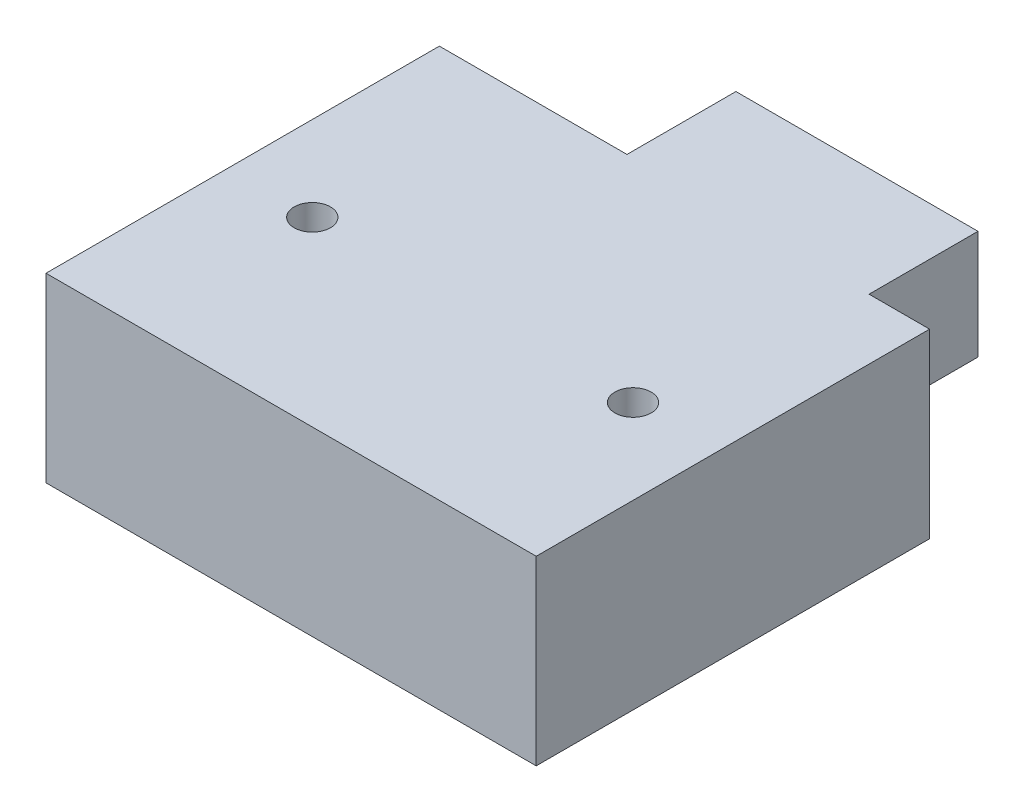
ISO-10303-21;
HEADER;
FILE_DESCRIPTION(('STEP AP214'),'2;1');
FILE_NAME('part.step','',(''),(''),'','','');
FILE_SCHEMA(('AUTOMOTIVE_DESIGN { 1 0 10303 214 1 1 1 1 }'));
ENDSEC;
DATA;
#1=APPLICATION_CONTEXT('core data for automotive mechanical design processes');
#2=APPLICATION_PROTOCOL_DEFINITION('international standard','automotive_design',2000,#1);
#3=PRODUCT_CONTEXT('',#1,'mechanical');
#4=PRODUCT('Part','Part','',(#3));
#5=PRODUCT_RELATED_PRODUCT_CATEGORY('part','',(#4));
#6=PRODUCT_DEFINITION_FORMATION('','',#4);
#7=PRODUCT_DEFINITION_CONTEXT('part definition',#1,'design');
#8=PRODUCT_DEFINITION('design','',#6,#7);
#9=PRODUCT_DEFINITION_SHAPE('','',#8);
#10=(LENGTH_UNIT() NAMED_UNIT(*) SI_UNIT(.MILLI.,.METRE.));
#11=(NAMED_UNIT(*) PLANE_ANGLE_UNIT() SI_UNIT($,.RADIAN.));
#12=(NAMED_UNIT(*) SI_UNIT($,.STERADIAN.) SOLID_ANGLE_UNIT());
#13=UNCERTAINTY_MEASURE_WITH_UNIT(LENGTH_MEASURE(1.E-05),#10,'distance_accuracy_value','');
#14=(GEOMETRIC_REPRESENTATION_CONTEXT(3) GLOBAL_UNCERTAINTY_ASSIGNED_CONTEXT((#13)) GLOBAL_UNIT_ASSIGNED_CONTEXT((#10,
#11,#12)) REPRESENTATION_CONTEXT('',''));
#15=CARTESIAN_POINT('',(0.,0.,0.));
#16=DIRECTION('',(0.,0.,1.));
#17=DIRECTION('',(1.,0.,0.));
#18=AXIS2_PLACEMENT_3D('',#15,#16,#17);
#19=CARTESIAN_POINT('',(-20.25,15.,-16.25));
#20=DIRECTION('',(0.,0.,1.));
#21=DIRECTION('',(1.,0.,0.));
#22=AXIS2_PLACEMENT_3D('',#19,#20,#21);
#23=PLANE('',#22);
#24=DIRECTION('',(0.,-1.,0.));
#25=VECTOR('',#24,1.);
#26=CARTESIAN_POINT('',(15.25,15.,-16.25));
#27=LINE('',#26,#25);
#28=CARTESIAN_POINT('',(15.25,15.,-16.25));
#29=VERTEX_POINT('',#28);
#30=CARTESIAN_POINT('',(15.25,6.,-16.25));
#31=VERTEX_POINT('',#30);
#32=EDGE_CURVE('E132',#29,#31,#27,.T.);
#33=ORIENTED_EDGE('',*,*,#32,.F.);
#34=DIRECTION('',(-1.,0.,0.));
#35=VECTOR('',#34,1.);
#36=CARTESIAN_POINT('',(-20.25,15.,-16.25));
#37=LINE('',#36,#35);
#38=CARTESIAN_POINT('',(20.25,15.,-16.25));
#39=VERTEX_POINT('',#38);
#40=EDGE_CURVE('E162',#39,#29,#37,.T.);
#41=ORIENTED_EDGE('',*,*,#40,.F.);
#42=DIRECTION('',(0.,-1.,0.));
#43=VECTOR('',#42,1.);
#44=CARTESIAN_POINT('',(20.25,15.,-16.25));
#45=LINE('',#44,#43);
#46=CARTESIAN_POINT('',(20.25,0.,-16.25));
#47=VERTEX_POINT('',#46);
#48=EDGE_CURVE('E11',#39,#47,#45,.T.);
#49=ORIENTED_EDGE('',*,*,#48,.T.);
#50=DIRECTION('',(-1.,0.,0.));
#51=VECTOR('',#50,1.);
#52=CARTESIAN_POINT('',(-20.25,0.,-16.25));
#53=LINE('',#52,#51);
#54=CARTESIAN_POINT('',(-20.25,0.,-16.25));
#55=VERTEX_POINT('',#54);
#56=EDGE_CURVE('E176',#47,#55,#53,.T.);
#57=ORIENTED_EDGE('',*,*,#56,.T.);
#58=DIRECTION('',(0.,-1.,0.));
#59=VECTOR('',#58,1.);
#60=CARTESIAN_POINT('',(-20.25,15.,-16.25));
#61=LINE('',#60,#59);
#62=CARTESIAN_POINT('',(-20.25,15.,-16.25));
#63=VERTEX_POINT('',#62);
#64=EDGE_CURVE('E52',#63,#55,#61,.T.);
#65=ORIENTED_EDGE('',*,*,#64,.F.);
#66=CARTESIAN_POINT('',(-4.75,15.,-16.25));
#67=VERTEX_POINT('',#66);
#68=EDGE_CURVE('E65',#67,#63,#37,.T.);
#69=ORIENTED_EDGE('',*,*,#68,.F.);
#70=DIRECTION('',(0.,1.,0.));
#71=VECTOR('',#70,1.);
#72=CARTESIAN_POINT('',(-4.75,15.,-16.25));
#73=LINE('',#72,#71);
#74=CARTESIAN_POINT('',(-4.75,6.,-16.25));
#75=VERTEX_POINT('',#74);
#76=EDGE_CURVE('E129',#75,#67,#73,.T.);
#77=ORIENTED_EDGE('',*,*,#76,.F.);
#78=DIRECTION('',(-1.,0.,0.));
#79=VECTOR('',#78,1.);
#80=CARTESIAN_POINT('',(15.25,6.,-16.25));
#81=LINE('',#80,#79);
#82=EDGE_CURVE('E59',#31,#75,#81,.T.);
#83=ORIENTED_EDGE('',*,*,#82,.F.);
#84=EDGE_LOOP('',(#33,#41,#49,#57,#65,#69,#77,#83));
#85=FACE_BOUND('',#84,.T.);
#86=ADVANCED_FACE('F43',(#85),#23,.F.);
#87=CARTESIAN_POINT('',(0.,15.,0.));
#88=DIRECTION('',(0.,-1.,0.));
#89=DIRECTION('',(0.,0.,-1.));
#90=AXIS2_PLACEMENT_3D('',#87,#88,#89);
#91=PLANE('',#90);
#92=DIRECTION('',(0.,0.,-1.));
#93=VECTOR('',#92,1.);
#94=CARTESIAN_POINT('',(20.25,15.,16.25));
#95=LINE('',#94,#93);
#96=CARTESIAN_POINT('',(20.25,15.,16.25));
#97=VERTEX_POINT('',#96);
#98=EDGE_CURVE('E157',#97,#39,#95,.T.);
#99=ORIENTED_EDGE('',*,*,#98,.T.);
#100=ORIENTED_EDGE('',*,*,#40,.T.);
#101=DIRECTION('',(0.,0.,1.));
#102=VECTOR('',#101,1.);
#103=CARTESIAN_POINT('',(15.25,15.,-25.25));
#104=LINE('',#103,#102);
#105=CARTESIAN_POINT('',(15.25,15.,-25.25));
#106=VERTEX_POINT('',#105);
#107=EDGE_CURVE('E217',#106,#29,#104,.T.);
#108=ORIENTED_EDGE('',*,*,#107,.F.);
#109=DIRECTION('',(1.,0.,0.));
#110=VECTOR('',#109,1.);
#111=CARTESIAN_POINT('',(15.25,15.,-25.25));
#112=LINE('',#111,#110);
#113=CARTESIAN_POINT('',(-4.75,15.,-25.25));
#114=VERTEX_POINT('',#113);
#115=EDGE_CURVE('E124',#114,#106,#112,.T.);
#116=ORIENTED_EDGE('',*,*,#115,.F.);
#117=DIRECTION('',(0.,0.,1.));
#118=VECTOR('',#117,1.);
#119=CARTESIAN_POINT('',(-4.75,15.,-25.25));
#120=LINE('',#119,#118);
#121=EDGE_CURVE('E141',#114,#67,#120,.T.);
#122=ORIENTED_EDGE('',*,*,#121,.T.);
#123=ORIENTED_EDGE('',*,*,#68,.T.);
#124=DIRECTION('',(0.,0.,1.));
#125=VECTOR('',#124,1.);
#126=CARTESIAN_POINT('',(-20.25,15.,16.25));
#127=LINE('',#126,#125);
#128=CARTESIAN_POINT('',(-20.25,15.,16.25));
#129=VERTEX_POINT('',#128);
#130=EDGE_CURVE('E166',#63,#129,#127,.T.);
#131=ORIENTED_EDGE('',*,*,#130,.T.);
#132=DIRECTION('',(1.,0.,0.));
#133=VECTOR('',#132,1.);
#134=CARTESIAN_POINT('',(-20.25,15.,16.25));
#135=LINE('',#134,#133);
#136=EDGE_CURVE('E169',#129,#97,#135,.T.);
#137=ORIENTED_EDGE('',*,*,#136,.T.);
#138=EDGE_LOOP('',(#99,#100,#108,#116,#122,#123,#131,#137));
#139=FACE_BOUND('',#138,.T.);
#140=CARTESIAN_POINT('',(-13.25,15.,1.25));
#141=DIRECTION('',(0.,1.,0.));
#142=DIRECTION('',(0.,0.,1.));
#143=AXIS2_PLACEMENT_3D('',#140,#141,#142);
#144=CIRCLE('',#143,1.5);
#145=CARTESIAN_POINT('',(-13.25,15.,2.75));
#146=VERTEX_POINT('',#145);
#147=EDGE_CURVE('E149',#146,#146,#144,.T.);
#148=ORIENTED_EDGE('',*,*,#147,.F.);
#149=EDGE_LOOP('',(#148));
#150=FACE_BOUND('',#149,.T.);
#151=CARTESIAN_POINT('',(13.25,15.,1.25));
#152=DIRECTION('',(0.,1.,0.));
#153=DIRECTION('',(0.,0.,1.));
#154=AXIS2_PLACEMENT_3D('',#151,#152,#153);
#155=CIRCLE('',#154,1.5);
#156=CARTESIAN_POINT('',(13.25,15.,2.75));
#157=VERTEX_POINT('',#156);
#158=EDGE_CURVE('E139',#157,#157,#155,.T.);
#159=ORIENTED_EDGE('',*,*,#158,.F.);
#160=EDGE_LOOP('',(#159));
#161=FACE_BOUND('',#160,.T.);
#162=ADVANCED_FACE('F210',(#139,#150,#161),#91,.F.);
#163=CARTESIAN_POINT('',(0.,0.,0.));
#164=DIRECTION('',(0.,-1.,0.));
#165=DIRECTION('',(0.,0.,-1.));
#166=AXIS2_PLACEMENT_3D('',#163,#164,#165);
#167=PLANE('',#166);
#168=CARTESIAN_POINT('',(-13.25,0.,1.25));
#169=DIRECTION('',(0.,1.,0.));
#170=DIRECTION('',(0.,0.,1.));
#171=AXIS2_PLACEMENT_3D('',#168,#169,#170);
#172=CIRCLE('',#171,1.5);
#173=CARTESIAN_POINT('',(-13.25,0.,2.75));
#174=VERTEX_POINT('',#173);
#175=EDGE_CURVE('E147',#174,#174,#172,.T.);
#176=ORIENTED_EDGE('',*,*,#175,.T.);
#177=EDGE_LOOP('',(#176));
#178=FACE_BOUND('',#177,.T.);
#179=DIRECTION('',(0.,0.,-1.));
#180=VECTOR('',#179,1.);
#181=CARTESIAN_POINT('',(20.25,0.,16.25));
#182=LINE('',#181,#180);
#183=CARTESIAN_POINT('',(20.25,0.,16.25));
#184=VERTEX_POINT('',#183);
#185=EDGE_CURVE('E153',#184,#47,#182,.T.);
#186=ORIENTED_EDGE('',*,*,#185,.F.);
#187=DIRECTION('',(1.,0.,0.));
#188=VECTOR('',#187,1.);
#189=CARTESIAN_POINT('',(-20.25,0.,16.25));
#190=LINE('',#189,#188);
#191=CARTESIAN_POINT('',(-20.25,0.,16.25));
#192=VERTEX_POINT('',#191);
#193=EDGE_CURVE('E161',#192,#184,#190,.T.);
#194=ORIENTED_EDGE('',*,*,#193,.F.);
#195=DIRECTION('',(0.,0.,1.));
#196=VECTOR('',#195,1.);
#197=CARTESIAN_POINT('',(-20.25,0.,16.25));
#198=LINE('',#197,#196);
#199=EDGE_CURVE('E179',#55,#192,#198,.T.);
#200=ORIENTED_EDGE('',*,*,#199,.F.);
#201=ORIENTED_EDGE('',*,*,#56,.F.);
#202=EDGE_LOOP('',(#186,#194,#200,#201));
#203=FACE_BOUND('',#202,.T.);
#204=CARTESIAN_POINT('',(13.25,0.,1.25));
#205=DIRECTION('',(0.,1.,0.));
#206=DIRECTION('',(0.,0.,1.));
#207=AXIS2_PLACEMENT_3D('',#204,#205,#206);
#208=CIRCLE('',#207,1.5);
#209=CARTESIAN_POINT('',(13.25,0.,2.75));
#210=VERTEX_POINT('',#209);
#211=EDGE_CURVE('E134',#210,#210,#208,.T.);
#212=ORIENTED_EDGE('',*,*,#211,.T.);
#213=EDGE_LOOP('',(#212));
#214=FACE_BOUND('',#213,.T.);
#215=ADVANCED_FACE('F200',(#178,#203,#214),#167,.T.);
#216=CARTESIAN_POINT('',(20.25,15.,16.25));
#217=DIRECTION('',(-1.,0.,0.));
#218=DIRECTION('',(0.,0.,1.));
#219=AXIS2_PLACEMENT_3D('',#216,#217,#218);
#220=PLANE('',#219);
#221=ORIENTED_EDGE('',*,*,#185,.T.);
#222=ORIENTED_EDGE('',*,*,#48,.F.);
#223=ORIENTED_EDGE('',*,*,#98,.F.);
#224=DIRECTION('',(0.,-1.,0.));
#225=VECTOR('',#224,1.);
#226=CARTESIAN_POINT('',(20.25,15.,16.25));
#227=LINE('',#226,#225);
#228=EDGE_CURVE('E172',#97,#184,#227,.T.);
#229=ORIENTED_EDGE('',*,*,#228,.T.);
#230=EDGE_LOOP('',(#221,#222,#223,#229));
#231=FACE_BOUND('',#230,.T.);
#232=ADVANCED_FACE('F45',(#231),#220,.F.);
#233=CARTESIAN_POINT('',(-20.25,15.,16.25));
#234=DIRECTION('',(1.,0.,0.));
#235=DIRECTION('',(0.,0.,-1.));
#236=AXIS2_PLACEMENT_3D('',#233,#234,#235);
#237=PLANE('',#236);
#238=ORIENTED_EDGE('',*,*,#199,.T.);
#239=DIRECTION('',(0.,-1.,0.));
#240=VECTOR('',#239,1.);
#241=CARTESIAN_POINT('',(-20.25,15.,16.25));
#242=LINE('',#241,#240);
#243=EDGE_CURVE('E187',#129,#192,#242,.T.);
#244=ORIENTED_EDGE('',*,*,#243,.F.);
#245=ORIENTED_EDGE('',*,*,#130,.F.);
#246=ORIENTED_EDGE('',*,*,#64,.T.);
#247=EDGE_LOOP('',(#238,#244,#245,#246));
#248=FACE_BOUND('',#247,.T.);
#249=ADVANCED_FACE('F195',(#248),#237,.F.);
#250=CARTESIAN_POINT('',(-20.25,15.,16.25));
#251=DIRECTION('',(0.,0.,-1.));
#252=DIRECTION('',(-1.,0.,0.));
#253=AXIS2_PLACEMENT_3D('',#250,#251,#252);
#254=PLANE('',#253);
#255=ORIENTED_EDGE('',*,*,#193,.T.);
#256=ORIENTED_EDGE('',*,*,#228,.F.);
#257=ORIENTED_EDGE('',*,*,#136,.F.);
#258=ORIENTED_EDGE('',*,*,#243,.T.);
#259=EDGE_LOOP('',(#255,#256,#257,#258));
#260=FACE_BOUND('',#259,.T.);
#261=ADVANCED_FACE('F204',(#260),#254,.F.);
#262=CARTESIAN_POINT('',(-13.25,15.,1.25));
#263=DIRECTION('',(0.,-1.,0.));
#264=DIRECTION('',(0.,0.,-1.));
#265=AXIS2_PLACEMENT_3D('',#262,#263,#264);
#266=CYLINDRICAL_SURFACE('',#265,1.5);
#267=ORIENTED_EDGE('',*,*,#147,.T.);
#268=EDGE_LOOP('',(#267));
#269=FACE_BOUND('',#268,.T.);
#270=ORIENTED_EDGE('',*,*,#175,.F.);
#271=EDGE_LOOP('',(#270));
#272=FACE_BOUND('',#271,.T.);
#273=ADVANCED_FACE('F241',(#269,#272),#266,.F.);
#274=CARTESIAN_POINT('',(13.25,15.,1.25));
#275=DIRECTION('',(0.,-1.,0.));
#276=DIRECTION('',(0.,0.,-1.));
#277=AXIS2_PLACEMENT_3D('',#274,#275,#276);
#278=CYLINDRICAL_SURFACE('',#277,1.5);
#279=ORIENTED_EDGE('',*,*,#158,.T.);
#280=EDGE_LOOP('',(#279));
#281=FACE_BOUND('',#280,.T.);
#282=ORIENTED_EDGE('',*,*,#211,.F.);
#283=EDGE_LOOP('',(#282));
#284=FACE_BOUND('',#283,.T.);
#285=ADVANCED_FACE('F247',(#281,#284),#278,.F.);
#286=CARTESIAN_POINT('',(15.25,15.,-25.25));
#287=DIRECTION('',(-1.,0.,0.));
#288=DIRECTION('',(0.,-1.,0.));
#289=AXIS2_PLACEMENT_3D('',#286,#287,#288);
#290=PLANE('',#289);
#291=ORIENTED_EDGE('',*,*,#32,.T.);
#292=DIRECTION('',(0.,0.,1.));
#293=VECTOR('',#292,1.);
#294=CARTESIAN_POINT('',(15.25,6.,-25.25));
#295=LINE('',#294,#293);
#296=CARTESIAN_POINT('',(15.25,6.,-25.25));
#297=VERTEX_POINT('',#296);
#298=EDGE_CURVE('E111',#297,#31,#295,.T.);
#299=ORIENTED_EDGE('',*,*,#298,.F.);
#300=DIRECTION('',(0.,-1.,0.));
#301=VECTOR('',#300,1.);
#302=CARTESIAN_POINT('',(15.25,15.,-25.25));
#303=LINE('',#302,#301);
#304=EDGE_CURVE('E119',#106,#297,#303,.T.);
#305=ORIENTED_EDGE('',*,*,#304,.F.);
#306=ORIENTED_EDGE('',*,*,#107,.T.);
#307=EDGE_LOOP('',(#291,#299,#305,#306));
#308=FACE_BOUND('',#307,.T.);
#309=ADVANCED_FACE('F131',(#308),#290,.F.);
#310=CARTESIAN_POINT('',(15.25,6.,-25.25));
#311=DIRECTION('',(0.,1.,0.));
#312=DIRECTION('',(0.,0.,1.));
#313=AXIS2_PLACEMENT_3D('',#310,#311,#312);
#314=PLANE('',#313);
#315=ORIENTED_EDGE('',*,*,#82,.T.);
#316=DIRECTION('',(0.,0.,1.));
#317=VECTOR('',#316,1.);
#318=CARTESIAN_POINT('',(-4.75,6.,-25.25));
#319=LINE('',#318,#317);
#320=CARTESIAN_POINT('',(-4.75,6.,-25.25));
#321=VERTEX_POINT('',#320);
#322=EDGE_CURVE('E114',#321,#75,#319,.T.);
#323=ORIENTED_EDGE('',*,*,#322,.F.);
#324=DIRECTION('',(-1.,0.,0.));
#325=VECTOR('',#324,1.);
#326=CARTESIAN_POINT('',(15.25,6.,-25.25));
#327=LINE('',#326,#325);
#328=EDGE_CURVE('E107',#297,#321,#327,.T.);
#329=ORIENTED_EDGE('',*,*,#328,.F.);
#330=ORIENTED_EDGE('',*,*,#298,.T.);
#331=EDGE_LOOP('',(#315,#323,#329,#330));
#332=FACE_BOUND('',#331,.T.);
#333=ADVANCED_FACE('F109',(#332),#314,.F.);
#334=CARTESIAN_POINT('',(-4.75,15.,-25.25));
#335=DIRECTION('',(1.,0.,0.));
#336=DIRECTION('',(0.,0.,-1.));
#337=AXIS2_PLACEMENT_3D('',#334,#335,#336);
#338=PLANE('',#337);
#339=ORIENTED_EDGE('',*,*,#76,.T.);
#340=ORIENTED_EDGE('',*,*,#121,.F.);
#341=DIRECTION('',(0.,1.,0.));
#342=VECTOR('',#341,1.);
#343=CARTESIAN_POINT('',(-4.75,15.,-25.25));
#344=LINE('',#343,#342);
#345=EDGE_CURVE('E118',#321,#114,#344,.T.);
#346=ORIENTED_EDGE('',*,*,#345,.F.);
#347=ORIENTED_EDGE('',*,*,#322,.T.);
#348=EDGE_LOOP('',(#339,#340,#346,#347));
#349=FACE_BOUND('',#348,.T.);
#350=ADVANCED_FACE('F230',(#349),#338,.F.);
#351=CARTESIAN_POINT('',(0.,0.,-25.25));
#352=DIRECTION('',(0.,0.,-1.));
#353=DIRECTION('',(-1.,0.,0.));
#354=AXIS2_PLACEMENT_3D('',#351,#352,#353);
#355=PLANE('',#354);
#356=ORIENTED_EDGE('',*,*,#304,.T.);
#357=ORIENTED_EDGE('',*,*,#328,.T.);
#358=ORIENTED_EDGE('',*,*,#345,.T.);
#359=ORIENTED_EDGE('',*,*,#115,.T.);
#360=EDGE_LOOP('',(#356,#357,#358,#359));
#361=FACE_BOUND('',#360,.T.);
#362=ADVANCED_FACE('F122',(#361),#355,.T.);
#363=CLOSED_SHELL('',(#86,#162,#215,#232,#249,#261,#273,#285,#309,#333,#350,#362));
#364=MANIFOLD_SOLID_BREP('B2',#363);
#365=ADVANCED_BREP_SHAPE_REPRESENTATION('',(#18,#364),#14);
#366=SHAPE_DEFINITION_REPRESENTATION(#9,#365);
ENDSEC;
END-ISO-10303-21;
